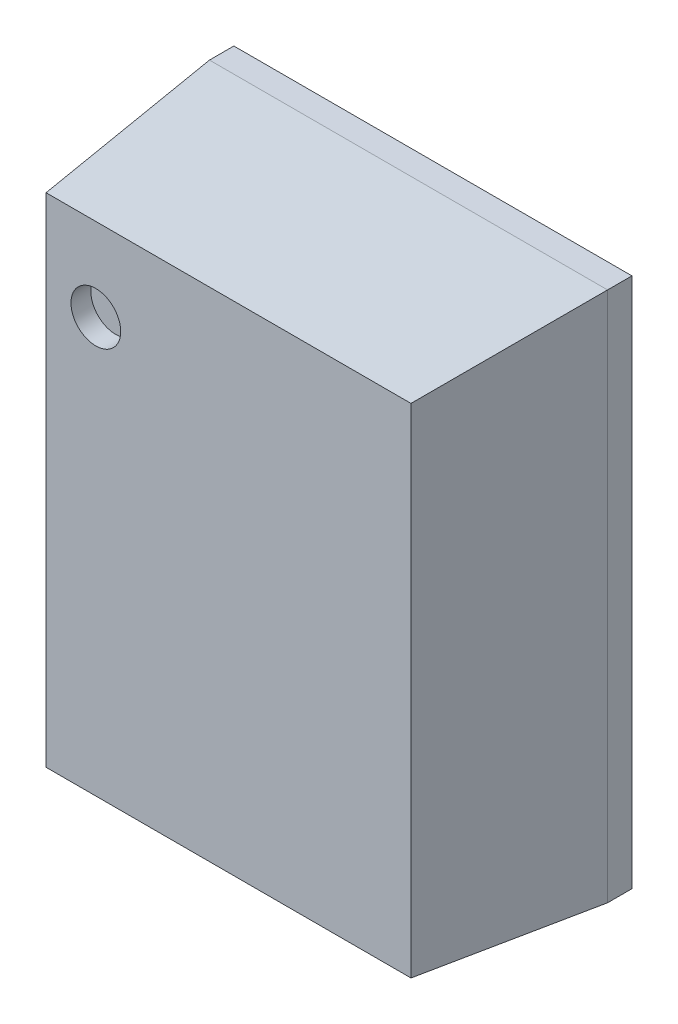
ISO-10303-21;
HEADER;
FILE_DESCRIPTION(('STEP AP214'),'2;1');
FILE_NAME('part.step','',(''),(''),'','','');
FILE_SCHEMA(('AUTOMOTIVE_DESIGN { 1 0 10303 214 1 1 1 1 }'));
ENDSEC;
DATA;
#1=APPLICATION_CONTEXT('core data for automotive mechanical design processes');
#2=APPLICATION_PROTOCOL_DEFINITION('international standard','automotive_design',2000,#1);
#3=PRODUCT_CONTEXT('',#1,'mechanical');
#4=PRODUCT('Part','Part','',(#3));
#5=PRODUCT_RELATED_PRODUCT_CATEGORY('part','',(#4));
#6=PRODUCT_DEFINITION_FORMATION('','',#4);
#7=PRODUCT_DEFINITION_CONTEXT('part definition',#1,'design');
#8=PRODUCT_DEFINITION('design','',#6,#7);
#9=PRODUCT_DEFINITION_SHAPE('','',#8);
#10=(LENGTH_UNIT() NAMED_UNIT(*) SI_UNIT(.MILLI.,.METRE.));
#11=(NAMED_UNIT(*) PLANE_ANGLE_UNIT() SI_UNIT($,.RADIAN.));
#12=(NAMED_UNIT(*) SI_UNIT($,.STERADIAN.) SOLID_ANGLE_UNIT());
#13=UNCERTAINTY_MEASURE_WITH_UNIT(LENGTH_MEASURE(1.E-05),#10,'distance_accuracy_value','');
#14=(GEOMETRIC_REPRESENTATION_CONTEXT(3) GLOBAL_UNCERTAINTY_ASSIGNED_CONTEXT((#13)) GLOBAL_UNIT_ASSIGNED_CONTEXT((#10,
#11,#12)) REPRESENTATION_CONTEXT('',''));
#15=CARTESIAN_POINT('',(0.,0.,0.));
#16=DIRECTION('',(0.,0.,1.));
#17=DIRECTION('',(1.,0.,0.));
#18=AXIS2_PLACEMENT_3D('',#15,#16,#17);
#19=CARTESIAN_POINT('',(-0.4,0.5,0.558));
#20=DIRECTION('',(0.,0.,1.));
#21=DIRECTION('',(1.,0.,0.));
#22=AXIS2_PLACEMENT_3D('',#19,#20,#21);
#23=PLANE('',#22);
#24=CARTESIAN_POINT('',(-0.4,0.5,0.558));
#25=DIRECTION('',(0.,0.,1.));
#26=DIRECTION('',(1.,0.,0.));
#27=AXIS2_PLACEMENT_3D('',#24,#25,#26);
#28=CIRCLE('',#27,0.075);
#29=CARTESIAN_POINT('',(-0.325,0.5,0.558));
#30=VERTEX_POINT('',#29);
#31=EDGE_CURVE('E20',#30,#30,#28,.T.);
#32=ORIENTED_EDGE('',*,*,#31,.T.);
#33=EDGE_LOOP('',(#32));
#34=FACE_BOUND('',#33,.T.);
#35=ADVANCED_FACE('F17',(#34),#23,.T.);
#36=CARTESIAN_POINT('',(-0.4,0.5,0.558));
#37=DIRECTION('',(0.,0.,1.));
#38=DIRECTION('',(1.,0.,0.));
#39=AXIS2_PLACEMENT_3D('',#36,#37,#38);
#40=CYLINDRICAL_SURFACE('',#39,0.075);
#41=ORIENTED_EDGE('',*,*,#31,.F.);
#42=EDGE_LOOP('',(#41));
#43=FACE_BOUND('',#42,.T.);
#44=CARTESIAN_POINT('',(-0.4,0.5,0.618));
#45=DIRECTION('',(0.,0.,1.));
#46=DIRECTION('',(1.,0.,0.));
#47=AXIS2_PLACEMENT_3D('',#44,#45,#46);
#48=CIRCLE('',#47,0.075);
#49=CARTESIAN_POINT('',(-0.325,0.5,0.618));
#50=VERTEX_POINT('',#49);
#51=EDGE_CURVE('E86',#50,#50,#48,.F.);
#52=ORIENTED_EDGE('',*,*,#51,.F.);
#53=EDGE_LOOP('',(#52));
#54=FACE_BOUND('',#53,.T.);
#55=ADVANCED_FACE('F102',(#43,#54),#40,.F.);
#56=CARTESIAN_POINT('',(-0.6,-0.8,0.618));
#57=DIRECTION('',(0.,0.,1.));
#58=DIRECTION('',(1.,0.,0.));
#59=AXIS2_PLACEMENT_3D('',#56,#57,#58);
#60=PLANE('',#59);
#61=ORIENTED_EDGE('',*,*,#51,.T.);
#62=EDGE_LOOP('',(#61));
#63=FACE_BOUND('',#62,.T.);
#64=DIRECTION('',(0.,1.,0.));
#65=VECTOR('',#64,1.);
#66=CARTESIAN_POINT('',(0.549999999999988,-0.8,0.617999999999999));
#67=LINE('',#66,#65);
#68=CARTESIAN_POINT('',(0.549999999999997,0.749999999999997,0.618));
#69=VERTEX_POINT('',#68);
#70=CARTESIAN_POINT('',(0.549999999999997,-0.749999999999994,0.617999999999999));
#71=VERTEX_POINT('',#70);
#72=EDGE_CURVE('E92',#69,#71,#67,.F.);
#73=ORIENTED_EDGE('',*,*,#72,.F.);
#74=DIRECTION('',(1.,0.,0.));
#75=VECTOR('',#74,1.);
#76=CARTESIAN_POINT('',(-0.6,0.749999999999988,0.617999999999999));
#77=LINE('',#76,#75);
#78=CARTESIAN_POINT('',(-0.549999999999997,0.749999999999997,0.618));
#79=VERTEX_POINT('',#78);
#80=EDGE_CURVE('E82',#79,#69,#77,.T.);
#81=ORIENTED_EDGE('',*,*,#80,.F.);
#82=DIRECTION('',(0.,1.,0.));
#83=VECTOR('',#82,1.);
#84=CARTESIAN_POINT('',(-0.549999999999988,-0.8,0.617999999999999));
#85=LINE('',#84,#83);
#86=CARTESIAN_POINT('',(-0.549999999999997,-0.749999999999997,0.618));
#87=VERTEX_POINT('',#86);
#88=EDGE_CURVE('E78',#79,#87,#85,.F.);
#89=ORIENTED_EDGE('',*,*,#88,.T.);
#90=DIRECTION('',(1.,0.,0.));
#91=VECTOR('',#90,1.);
#92=CARTESIAN_POINT('',(-0.6,-0.749999999999988,0.617999999999999));
#93=LINE('',#92,#91);
#94=EDGE_CURVE('E68',#87,#71,#93,.T.);
#95=ORIENTED_EDGE('',*,*,#94,.T.);
#96=EDGE_LOOP('',(#73,#81,#89,#95));
#97=FACE_BOUND('',#96,.T.);
#98=ADVANCED_FACE('F81',(#63,#97),#60,.T.);
#99=CARTESIAN_POINT('',(-0.575,-0.8,0.34675));
#100=DIRECTION('',(0.995779592469234,0.,-0.0917769209649515));
#101=DIRECTION('',(-0.0917769209649515,0.,-0.995779592469234));
#102=AXIS2_PLACEMENT_3D('',#99,#100,#101);
#103=PLANE('',#102);
#104=DIRECTION('',(0.0913928270367066,-0.0913928270367514,0.991612173348265));
#105=VECTOR('',#104,1.);
#106=CARTESIAN_POINT('',(-0.6,0.800000000000012,0.0755000000000011));
#107=LINE('',#106,#105);
#108=CARTESIAN_POINT('',(-0.600000000000006,0.800000000000002,0.0755000000000007));
#109=VERTEX_POINT('',#108);
#110=EDGE_CURVE('E226',#109,#79,#107,.T.);
#111=ORIENTED_EDGE('',*,*,#110,.F.);
#112=DIRECTION('',(0.,1.,0.));
#113=VECTOR('',#112,1.);
#114=CARTESIAN_POINT('',(-0.6,-0.8,0.0755));
#115=LINE('',#114,#113);
#116=CARTESIAN_POINT('',(-0.600000000000006,-0.800000000000002,0.0755000000000007));
#117=VERTEX_POINT('',#116);
#118=EDGE_CURVE('E89',#109,#117,#115,.F.);
#119=ORIENTED_EDGE('',*,*,#118,.T.);
#120=DIRECTION('',(0.0913928270367066,0.0913928270367514,0.991612173348265));
#121=VECTOR('',#120,1.);
#122=CARTESIAN_POINT('',(-0.6,-0.800000000000012,0.0755000000000011));
#123=LINE('',#122,#121);
#124=EDGE_CURVE('E75',#117,#87,#123,.T.);
#125=ORIENTED_EDGE('',*,*,#124,.T.);
#126=ORIENTED_EDGE('',*,*,#88,.F.);
#127=EDGE_LOOP('',(#111,#119,#125,#126));
#128=FACE_BOUND('',#127,.T.);
#129=ADVANCED_FACE('F88',(#128),#103,.F.);
#130=CARTESIAN_POINT('',(-0.6,-0.775,0.34675));
#131=DIRECTION('',(0.,0.995779592469234,-0.0917769209649515));
#132=DIRECTION('',(0.,0.0917769209649515,0.995779592469234));
#133=AXIS2_PLACEMENT_3D('',#130,#131,#132);
#134=PLANE('',#133);
#135=DIRECTION('',(1.,0.,0.));
#136=VECTOR('',#135,1.);
#137=CARTESIAN_POINT('',(-0.6,-0.8,0.0755));
#138=LINE('',#137,#136);
#139=CARTESIAN_POINT('',(0.600000000000002,-0.800000000000006,0.0755000000000007));
#140=VERTEX_POINT('',#139);
#141=EDGE_CURVE('E235',#117,#140,#138,.T.);
#142=ORIENTED_EDGE('',*,*,#141,.T.);
#143=DIRECTION('',(0.0913928270367514,-0.0913928270367068,-0.991612173348265));
#144=VECTOR('',#143,1.);
#145=CARTESIAN_POINT('',(0.549999999999988,-0.75,0.617999999999999));
#146=LINE('',#145,#144);
#147=EDGE_CURVE('E77',#71,#140,#146,.T.);
#148=ORIENTED_EDGE('',*,*,#147,.F.);
#149=ORIENTED_EDGE('',*,*,#94,.F.);
#150=ORIENTED_EDGE('',*,*,#124,.F.);
#151=EDGE_LOOP('',(#142,#148,#149,#150));
#152=FACE_BOUND('',#151,.T.);
#153=ADVANCED_FACE('F73',(#152),#134,.F.);
#154=CARTESIAN_POINT('',(0.575,-0.8,0.34675));
#155=DIRECTION('',(0.995779592469234,0.,0.0917769209649515));
#156=DIRECTION('',(0.0917769209649515,0.,-0.995779592469234));
#157=AXIS2_PLACEMENT_3D('',#154,#155,#156);
#158=PLANE('',#157);
#159=DIRECTION('',(0.0913928270367066,0.0913928270367514,-0.991612173348265));
#160=VECTOR('',#159,1.);
#161=CARTESIAN_POINT('',(0.55,0.749999999999988,0.617999999999999));
#162=LINE('',#161,#160);
#163=CARTESIAN_POINT('',(0.600000000000006,0.800000000000002,0.0755000000000007));
#164=VERTEX_POINT('',#163);
#165=EDGE_CURVE('E222',#69,#164,#162,.T.);
#166=ORIENTED_EDGE('',*,*,#165,.F.);
#167=ORIENTED_EDGE('',*,*,#72,.T.);
#168=ORIENTED_EDGE('',*,*,#147,.T.);
#169=DIRECTION('',(0.,1.,0.));
#170=VECTOR('',#169,1.);
#171=CARTESIAN_POINT('',(0.6,-0.8,0.0755));
#172=LINE('',#171,#170);
#173=EDGE_CURVE('E224',#164,#140,#172,.F.);
#174=ORIENTED_EDGE('',*,*,#173,.F.);
#175=EDGE_LOOP('',(#166,#167,#168,#174));
#176=FACE_BOUND('',#175,.T.);
#177=ADVANCED_FACE('F137',(#176),#158,.T.);
#178=CARTESIAN_POINT('',(-0.6,0.775,0.34675));
#179=DIRECTION('',(0.,0.995779592469234,0.0917769209649515));
#180=DIRECTION('',(0.,-0.0917769209649515,0.995779592469234));
#181=AXIS2_PLACEMENT_3D('',#178,#179,#180);
#182=PLANE('',#181);
#183=DIRECTION('',(1.,0.,0.));
#184=VECTOR('',#183,1.);
#185=CARTESIAN_POINT('',(-0.6,0.8,0.0755));
#186=LINE('',#185,#184);
#187=EDGE_CURVE('E244',#109,#164,#186,.T.);
#188=ORIENTED_EDGE('',*,*,#187,.F.);
#189=ORIENTED_EDGE('',*,*,#110,.T.);
#190=ORIENTED_EDGE('',*,*,#80,.T.);
#191=ORIENTED_EDGE('',*,*,#165,.T.);
#192=EDGE_LOOP('',(#188,#189,#190,#191));
#193=FACE_BOUND('',#192,.T.);
#194=ADVANCED_FACE('F133',(#193),#182,.T.);
#195=CARTESIAN_POINT('',(-0.6,-0.8,0.002));
#196=DIRECTION('',(1.,0.,0.));
#197=DIRECTION('',(0.,0.,-1.));
#198=AXIS2_PLACEMENT_3D('',#195,#196,#197);
#199=PLANE('',#198);
#200=DIRECTION('',(0.,0.,1.));
#201=VECTOR('',#200,1.);
#202=CARTESIAN_POINT('',(-0.6,0.8,0.002));
#203=LINE('',#202,#201);
#204=CARTESIAN_POINT('',(-0.6,0.8,0.002));
#205=VERTEX_POINT('',#204);
#206=EDGE_CURVE('E241',#205,#109,#203,.T.);
#207=ORIENTED_EDGE('',*,*,#206,.F.);
#208=DIRECTION('',(0.,1.,0.));
#209=VECTOR('',#208,1.);
#210=CARTESIAN_POINT('',(-0.6,-0.8,0.002));
#211=LINE('',#210,#209);
#212=CARTESIAN_POINT('',(-0.6,-0.8,0.002));
#213=VERTEX_POINT('',#212);
#214=EDGE_CURVE('E246',#205,#213,#211,.F.);
#215=ORIENTED_EDGE('',*,*,#214,.T.);
#216=DIRECTION('',(0.,0.,1.));
#217=VECTOR('',#216,1.);
#218=CARTESIAN_POINT('',(-0.6,-0.8,0.002));
#219=LINE('',#218,#217);
#220=EDGE_CURVE('E232',#213,#117,#219,.T.);
#221=ORIENTED_EDGE('',*,*,#220,.T.);
#222=ORIENTED_EDGE('',*,*,#118,.F.);
#223=EDGE_LOOP('',(#207,#215,#221,#222));
#224=FACE_BOUND('',#223,.T.);
#225=ADVANCED_FACE('F129',(#224),#199,.F.);
#226=CARTESIAN_POINT('',(-0.6,-0.8,0.002));
#227=DIRECTION('',(0.,1.,0.));
#228=DIRECTION('',(0.,0.,1.));
#229=AXIS2_PLACEMENT_3D('',#226,#227,#228);
#230=PLANE('',#229);
#231=ORIENTED_EDGE('',*,*,#220,.F.);
#232=DIRECTION('',(1.,0.,0.));
#233=VECTOR('',#232,1.);
#234=CARTESIAN_POINT('',(-0.6,-0.8,0.002));
#235=LINE('',#234,#233);
#236=CARTESIAN_POINT('',(0.6,-0.8,0.002));
#237=VERTEX_POINT('',#236);
#238=EDGE_CURVE('E249',#213,#237,#235,.T.);
#239=ORIENTED_EDGE('',*,*,#238,.T.);
#240=DIRECTION('',(0.,0.,-1.));
#241=VECTOR('',#240,1.);
#242=CARTESIAN_POINT('',(0.6,-0.8,0.002));
#243=LINE('',#242,#241);
#244=EDGE_CURVE('E237',#140,#237,#243,.T.);
#245=ORIENTED_EDGE('',*,*,#244,.F.);
#246=ORIENTED_EDGE('',*,*,#141,.F.);
#247=EDGE_LOOP('',(#231,#239,#245,#246));
#248=FACE_BOUND('',#247,.T.);
#249=ADVANCED_FACE('F125',(#248),#230,.F.);
#250=CARTESIAN_POINT('',(0.6,-0.8,0.002));
#251=DIRECTION('',(1.,0.,0.));
#252=DIRECTION('',(0.,0.,-1.));
#253=AXIS2_PLACEMENT_3D('',#250,#251,#252);
#254=PLANE('',#253);
#255=DIRECTION('',(0.,0.,1.));
#256=VECTOR('',#255,1.);
#257=CARTESIAN_POINT('',(0.6,0.8,0.002));
#258=LINE('',#257,#256);
#259=CARTESIAN_POINT('',(0.6,0.8,0.002));
#260=VERTEX_POINT('',#259);
#261=EDGE_CURVE('E34',#164,#260,#258,.F.);
#262=ORIENTED_EDGE('',*,*,#261,.F.);
#263=ORIENTED_EDGE('',*,*,#173,.T.);
#264=ORIENTED_EDGE('',*,*,#244,.T.);
#265=DIRECTION('',(0.,1.,0.));
#266=VECTOR('',#265,1.);
#267=CARTESIAN_POINT('',(0.6,-0.8,0.002));
#268=LINE('',#267,#266);
#269=EDGE_CURVE('E26',#237,#260,#268,.T.);
#270=ORIENTED_EDGE('',*,*,#269,.T.);
#271=EDGE_LOOP('',(#262,#263,#264,#270));
#272=FACE_BOUND('',#271,.T.);
#273=ADVANCED_FACE('F119',(#272),#254,.T.);
#274=CARTESIAN_POINT('',(-0.6,0.8,0.002));
#275=DIRECTION('',(0.,1.,0.));
#276=DIRECTION('',(0.,0.,1.));
#277=AXIS2_PLACEMENT_3D('',#274,#275,#276);
#278=PLANE('',#277);
#279=ORIENTED_EDGE('',*,*,#206,.T.);
#280=ORIENTED_EDGE('',*,*,#187,.T.);
#281=ORIENTED_EDGE('',*,*,#261,.T.);
#282=DIRECTION('',(1.,0.,0.));
#283=VECTOR('',#282,1.);
#284=CARTESIAN_POINT('',(-0.6,0.8,0.002));
#285=LINE('',#284,#283);
#286=EDGE_CURVE('E11',#260,#205,#285,.F.);
#287=ORIENTED_EDGE('',*,*,#286,.T.);
#288=EDGE_LOOP('',(#279,#280,#281,#287));
#289=FACE_BOUND('',#288,.T.);
#290=ADVANCED_FACE('F113',(#289),#278,.T.);
#291=CARTESIAN_POINT('',(-0.6,-0.8,0.002));
#292=DIRECTION('',(0.,0.,1.));
#293=DIRECTION('',(1.,0.,0.));
#294=AXIS2_PLACEMENT_3D('',#291,#292,#293);
#295=PLANE('',#294);
#296=ORIENTED_EDGE('',*,*,#269,.F.);
#297=ORIENTED_EDGE('',*,*,#238,.F.);
#298=ORIENTED_EDGE('',*,*,#214,.F.);
#299=ORIENTED_EDGE('',*,*,#286,.F.);
#300=EDGE_LOOP('',(#296,#297,#298,#299));
#301=FACE_BOUND('',#300,.T.);
#302=ADVANCED_FACE('F111',(#301),#295,.F.);
#303=CLOSED_SHELL('',(#35,#55,#98,#129,#153,#177,#194,#225,#249,#273,#290,#302));
#304=MANIFOLD_SOLID_BREP('B1',#303);
#305=ADVANCED_BREP_SHAPE_REPRESENTATION('',(#18,#304),#14);
#306=SHAPE_DEFINITION_REPRESENTATION(#9,#305);
ENDSEC;
END-ISO-10303-21;
